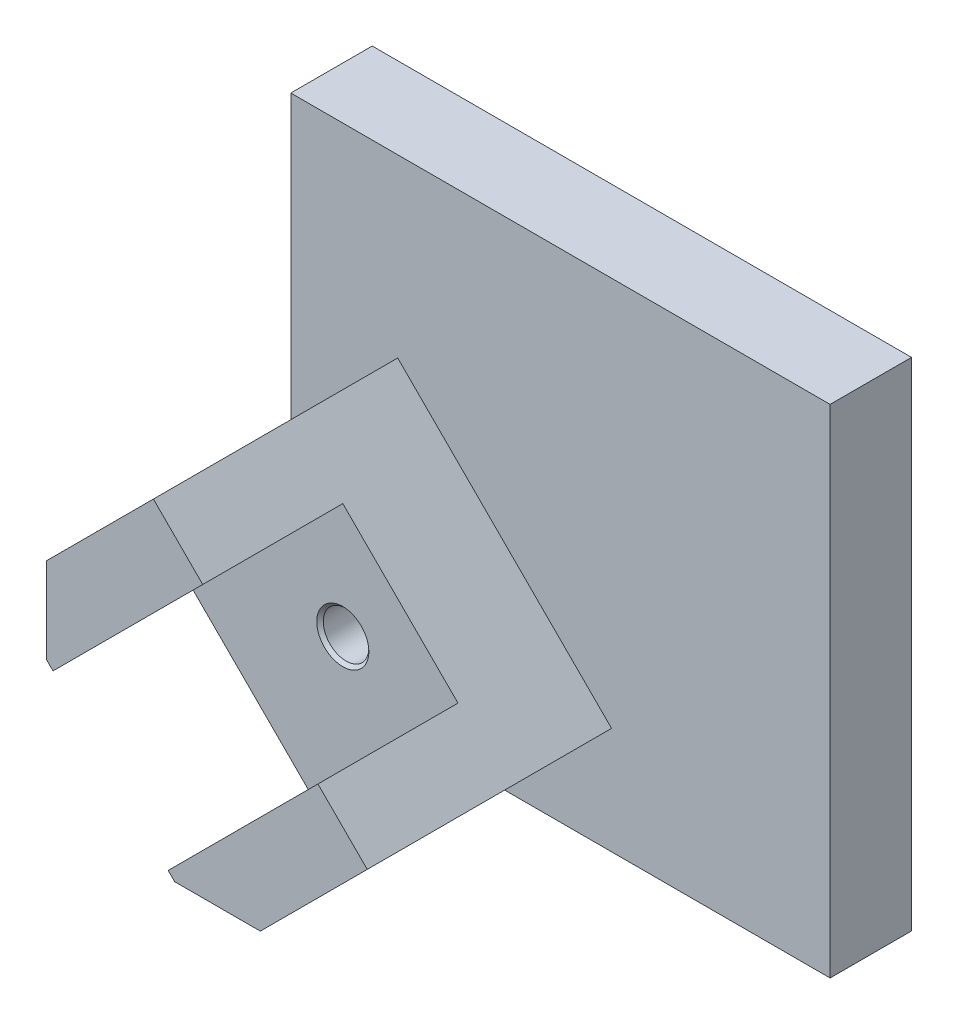
ISO-10303-21;
HEADER;
FILE_DESCRIPTION(('STEP AP214'),'2;1');
FILE_NAME('part.step','',(''),(''),'','','');
FILE_SCHEMA(('AUTOMOTIVE_DESIGN { 1 0 10303 214 1 1 1 1 }'));
ENDSEC;
DATA;
#1=APPLICATION_CONTEXT('core data for automotive mechanical design processes');
#2=APPLICATION_PROTOCOL_DEFINITION('international standard','automotive_design',2000,#1);
#3=PRODUCT_CONTEXT('',#1,'mechanical');
#4=PRODUCT('Part','Part','',(#3));
#5=PRODUCT_RELATED_PRODUCT_CATEGORY('part','',(#4));
#6=PRODUCT_DEFINITION_FORMATION('','',#4);
#7=PRODUCT_DEFINITION_CONTEXT('part definition',#1,'design');
#8=PRODUCT_DEFINITION('design','',#6,#7);
#9=PRODUCT_DEFINITION_SHAPE('','',#8);
#10=(LENGTH_UNIT() NAMED_UNIT(*) SI_UNIT(.MILLI.,.METRE.));
#11=(NAMED_UNIT(*) PLANE_ANGLE_UNIT() SI_UNIT($,.RADIAN.));
#12=(NAMED_UNIT(*) SI_UNIT($,.STERADIAN.) SOLID_ANGLE_UNIT());
#13=UNCERTAINTY_MEASURE_WITH_UNIT(LENGTH_MEASURE(1.E-05),#10,'distance_accuracy_value','');
#14=(GEOMETRIC_REPRESENTATION_CONTEXT(3) GLOBAL_UNCERTAINTY_ASSIGNED_CONTEXT((#13)) GLOBAL_UNIT_ASSIGNED_CONTEXT((#10,
#11,#12)) REPRESENTATION_CONTEXT('',''));
#15=CARTESIAN_POINT('',(0.,0.,0.));
#16=DIRECTION('',(0.,0.,1.));
#17=DIRECTION('',(1.,0.,0.));
#18=AXIS2_PLACEMENT_3D('',#15,#16,#17);
#19=CARTESIAN_POINT('',(-81.3335645941824,-26.8138207152516,-0.254000000000001));
#20=DIRECTION('',(0.,0.,-1.));
#21=DIRECTION('',(0.,1.,0.));
#22=AXIS2_PLACEMENT_3D('',#19,#20,#21);
#23=PLANE('',#22);
#24=DIRECTION('',(-0.707106781186548,-0.707106781186547,0.));
#25=VECTOR('',#24,1.);
#26=CARTESIAN_POINT('',(-81.3335645941824,-26.8138207152516,-0.254000000000001));
#27=LINE('',#26,#25);
#28=CARTESIAN_POINT('',(-81.3335645941824,-26.8138207152516,-0.254000000000001));
#29=VERTEX_POINT('',#28);
#30=CARTESIAN_POINT('',(-91.8404642558334,-37.3207203769025,-0.254000000000001));
#31=VERTEX_POINT('',#30);
#32=EDGE_CURVE('E374',#29,#31,#27,.T.);
#33=ORIENTED_EDGE('',*,*,#32,.T.);
#34=DIRECTION('',(-0.707106781186547,0.707106781186548,0.));
#35=VECTOR('',#34,1.);
#36=CARTESIAN_POINT('',(-100.820720376903,-28.3404642558334,-0.254));
#37=LINE('',#36,#35);
#38=CARTESIAN_POINT('',(-100.820720376903,-28.3404642558334,-0.254));
#39=VERTEX_POINT('',#38);
#40=EDGE_CURVE('E446',#31,#39,#37,.T.);
#41=ORIENTED_EDGE('',*,*,#40,.T.);
#42=DIRECTION('',(-0.707106781186548,-0.707106781186547,0.));
#43=VECTOR('',#42,1.);
#44=CARTESIAN_POINT('',(-90.3138207152516,-17.8335645941824,-0.254));
#45=LINE('',#44,#43);
#46=CARTESIAN_POINT('',(-90.3138207152516,-17.8335645941824,-0.254));
#47=VERTEX_POINT('',#46);
#48=EDGE_CURVE('E371',#47,#39,#45,.T.);
#49=ORIENTED_EDGE('',*,*,#48,.F.);
#50=DIRECTION('',(0.707106781186547,-0.707106781186548,0.));
#51=VECTOR('',#50,1.);
#52=CARTESIAN_POINT('',(-81.3335645941824,-26.8138207152516,-0.254000000000001));
#53=LINE('',#52,#51);
#54=EDGE_CURVE('E362',#47,#29,#53,.T.);
#55=ORIENTED_EDGE('',*,*,#54,.T.);
#56=EDGE_LOOP('',(#33,#41,#49,#55));
#57=FACE_BOUND('',#56,.T.);
#58=DIRECTION('',(1.,0.,0.));
#59=VECTOR('',#58,1.);
#60=CARTESIAN_POINT('',(-91.6154996287571,-29.7257951031447,-0.254000000000001));
#61=LINE('',#60,#59);
#62=CARTESIAN_POINT('',(-91.6154996287571,-29.7257951031447,-0.254000000000001));
#63=VERTEX_POINT('',#62);
#64=CARTESIAN_POINT('',(-87.2160905775322,-29.7257951031447,-0.254000000000001));
#65=VERTEX_POINT('',#64);
#66=EDGE_CURVE('E271',#63,#65,#61,.T.);
#67=ORIENTED_EDGE('',*,*,#66,.T.);
#68=DIRECTION('',(0.500000000000001,0.866025403784438,0.));
#69=VECTOR('',#68,1.);
#70=CARTESIAN_POINT('',(-87.2160905775322,-29.7257951031447,-0.254000000000001));
#71=LINE('',#70,#69);
#72=CARTESIAN_POINT('',(-85.0163860519197,-25.9157951031447,-0.254000000000001));
#73=VERTEX_POINT('',#72);
#74=EDGE_CURVE('E63',#65,#73,#71,.T.);
#75=ORIENTED_EDGE('',*,*,#74,.T.);
#76=DIRECTION('',(-0.5,0.866025403784438,0.));
#77=VECTOR('',#76,1.);
#78=CARTESIAN_POINT('',(-85.0163860519197,-25.9157951031447,-0.254000000000001));
#79=LINE('',#78,#77);
#80=CARTESIAN_POINT('',(-87.2160905775322,-22.1057951031447,-0.254000000000001));
#81=VERTEX_POINT('',#80);
#82=EDGE_CURVE('E259',#73,#81,#79,.T.);
#83=ORIENTED_EDGE('',*,*,#82,.T.);
#84=DIRECTION('',(-1.,0.,0.));
#85=VECTOR('',#84,1.);
#86=CARTESIAN_POINT('',(-87.2160905775322,-22.1057951031447,-0.254000000000001));
#87=LINE('',#86,#85);
#88=CARTESIAN_POINT('',(-91.6154996287571,-22.1057951031447,-0.254));
#89=VERTEX_POINT('',#88);
#90=EDGE_CURVE('E280',#81,#89,#87,.T.);
#91=ORIENTED_EDGE('',*,*,#90,.T.);
#92=DIRECTION('',(-0.500000000000001,-0.866025403784438,0.));
#93=VECTOR('',#92,1.);
#94=CARTESIAN_POINT('',(-91.6154996287571,-22.1057951031447,-0.254));
#95=LINE('',#94,#93);
#96=CARTESIAN_POINT('',(-93.8152041543696,-25.9157951031447,-0.254));
#97=VERTEX_POINT('',#96);
#98=EDGE_CURVE('E277',#89,#97,#95,.T.);
#99=ORIENTED_EDGE('',*,*,#98,.T.);
#100=DIRECTION('',(0.5,-0.866025403784438,0.));
#101=VECTOR('',#100,1.);
#102=CARTESIAN_POINT('',(-93.8152041543696,-25.9157951031447,-0.254));
#103=LINE('',#102,#101);
#104=EDGE_CURVE('E274',#97,#63,#103,.T.);
#105=ORIENTED_EDGE('',*,*,#104,.T.);
#106=EDGE_LOOP('',(#67,#75,#83,#91,#99,#105));
#107=FACE_BOUND('',#106,.T.);
#108=ADVANCED_FACE('F40',(#57,#107),#23,.T.);
#109=CARTESIAN_POINT('',(-89.4157951031446,-25.9157951031447,-5.28294342779873));
#110=DIRECTION('',(0.,0.,1.));
#111=DIRECTION('',(1.,0.,0.));
#112=AXIS2_PLACEMENT_3D('',#109,#110,#111);
#113=CYLINDRICAL_SURFACE('',#112,1.77800000000001);
#114=CARTESIAN_POINT('',(-89.4157951031446,-25.9157951031447,7.87399999999997));
#115=DIRECTION('',(0.,0.,1.));
#116=DIRECTION('',(1.,0.,0.));
#117=AXIS2_PLACEMENT_3D('',#114,#115,#116);
#118=CIRCLE('',#117,1.77800000000001);
#119=CARTESIAN_POINT('',(-87.6377951031446,-25.9157951031447,7.87399999999997));
#120=VERTEX_POINT('',#119);
#121=EDGE_CURVE('E455',#120,#120,#118,.T.);
#122=ORIENTED_EDGE('',*,*,#121,.T.);
#123=EDGE_LOOP('',(#122));
#124=FACE_BOUND('',#123,.T.);
#125=CARTESIAN_POINT('',(-89.4157951031446,-25.9157951031447,3.048));
#126=DIRECTION('',(0.,0.,-1.));
#127=DIRECTION('',(-1.,0.,0.));
#128=AXIS2_PLACEMENT_3D('',#125,#126,#127);
#129=CIRCLE('',#128,1.77800000000001);
#130=CARTESIAN_POINT('',(-91.1937951031446,-25.9157951031447,3.048));
#131=VERTEX_POINT('',#130);
#132=EDGE_CURVE('E287',#131,#131,#129,.T.);
#133=ORIENTED_EDGE('',*,*,#132,.T.);
#134=EDGE_LOOP('',(#133));
#135=FACE_BOUND('',#134,.T.);
#136=ADVANCED_FACE('F516',(#124,#135),#113,.F.);
#137=CARTESIAN_POINT('',(0.,0.,0.));
#138=DIRECTION('',(0.,0.,1.));
#139=DIRECTION('',(1.,0.,0.));
#140=AXIS2_PLACEMENT_3D('',#137,#138,#139);
#141=PLANE('',#140);
#142=DIRECTION('',(0.,-1.,0.));
#143=VECTOR('',#142,1.);
#144=CARTESIAN_POINT('',(-59.5491194918497,0.,0.));
#145=LINE('',#144,#143);
#146=CARTESIAN_POINT('',(-59.5491194918497,0.634999999999986,0.));
#147=VERTEX_POINT('',#146);
#148=CARTESIAN_POINT('',(-59.5491194918497,-38.1,0.));
#149=VERTEX_POINT('',#148);
#150=EDGE_CURVE('E253',#147,#149,#145,.T.);
#151=ORIENTED_EDGE('',*,*,#150,.F.);
#152=DIRECTION('',(1.,0.,0.));
#153=VECTOR('',#152,1.);
#154=CARTESIAN_POINT('',(0.,0.634999999999989,0.));
#155=LINE('',#154,#153);
#156=CARTESIAN_POINT('',(-101.6,0.634999999999983,0.));
#157=VERTEX_POINT('',#156);
#158=EDGE_CURVE('E235',#157,#147,#155,.T.);
#159=ORIENTED_EDGE('',*,*,#158,.F.);
#160=DIRECTION('',(0.,1.,0.));
#161=VECTOR('',#160,1.);
#162=CARTESIAN_POINT('',(-101.6,-28.1,0.));
#163=LINE('',#162,#161);
#164=CARTESIAN_POINT('',(-101.6,-21.4256670426101,0.));
#165=VERTEX_POINT('',#164);
#166=EDGE_CURVE('E418',#165,#157,#163,.T.);
#167=ORIENTED_EDGE('',*,*,#166,.F.);
#168=DIRECTION('',(-0.707106781186548,-0.707106781186547,0.));
#169=VECTOR('',#168,1.);
#170=CARTESIAN_POINT('',(-101.6,-21.4256670426101,0.));
#171=LINE('',#170,#169);
#172=CARTESIAN_POINT('',(-93.262833521305,-13.0885005639151,0.));
#173=VERTEX_POINT('',#172);
#174=EDGE_CURVE('E383',#173,#165,#171,.T.);
#175=ORIENTED_EDGE('',*,*,#174,.F.);
#176=DIRECTION('',(-0.707106781186548,0.707106781186547,0.));
#177=VECTOR('',#176,1.);
#178=CARTESIAN_POINT('',(-76.5885005639151,-29.762833521305,0.));
#179=LINE('',#178,#177);
#180=CARTESIAN_POINT('',(-76.5885005639151,-29.762833521305,0.));
#181=VERTEX_POINT('',#180);
#182=EDGE_CURVE('E400',#181,#173,#179,.T.);
#183=ORIENTED_EDGE('',*,*,#182,.F.);
#184=DIRECTION('',(0.707106781186547,0.707106781186547,0.));
#185=VECTOR('',#184,1.);
#186=CARTESIAN_POINT('',(-84.9256670426101,-38.1,0.));
#187=LINE('',#186,#185);
#188=CARTESIAN_POINT('',(-84.9256670426101,-38.1,0.));
#189=VERTEX_POINT('',#188);
#190=EDGE_CURVE('E370',#189,#181,#187,.T.);
#191=ORIENTED_EDGE('',*,*,#190,.F.);
#192=DIRECTION('',(-1.,0.,0.));
#193=VECTOR('',#192,1.);
#194=CARTESIAN_POINT('',(91.6,-38.1,0.));
#195=LINE('',#194,#193);
#196=EDGE_CURVE('E414',#149,#189,#195,.T.);
#197=ORIENTED_EDGE('',*,*,#196,.F.);
#198=EDGE_LOOP('',(#151,#159,#167,#175,#183,#191,#197));
#199=FACE_BOUND('',#198,.T.);
#200=ADVANCED_FACE('F463',(#199),#141,.T.);
#201=CARTESIAN_POINT('',(0.,0.,19.05));
#202=DIRECTION('',(0.,0.,-1.));
#203=DIRECTION('',(-1.,0.,0.));
#204=AXIS2_PLACEMENT_3D('',#201,#202,#203);
#205=PLANE('',#204);
#206=DIRECTION('',(-0.707106781186548,0.707106781186547,0.));
#207=VECTOR('',#206,1.);
#208=CARTESIAN_POINT('',(-76.5885005639151,-29.762833521305,19.05));
#209=LINE('',#208,#207);
#210=CARTESIAN_POINT('',(-76.5885005639151,-29.762833521305,19.05));
#211=VERTEX_POINT('',#210);
#212=CARTESIAN_POINT('',(-80.4355389820755,-25.9157951031447,19.05));
#213=VERTEX_POINT('',#212);
#214=EDGE_CURVE('E386',#211,#213,#209,.T.);
#215=ORIENTED_EDGE('',*,*,#214,.T.);
#216=DIRECTION('',(0.707106781186548,0.707106781186547,0.));
#217=VECTOR('',#216,1.);
#218=CARTESIAN_POINT('',(-92.1098719394654,-37.5901280605346,19.05));
#219=LINE('',#218,#217);
#220=CARTESIAN_POINT('',(-92.1098719394654,-37.5901280605346,19.05));
#221=VERTEX_POINT('',#220);
#222=EDGE_CURVE('E310',#221,#213,#219,.T.);
#223=ORIENTED_EDGE('',*,*,#222,.F.);
#224=DIRECTION('',(0.707106781186547,-0.707106781186548,0.));
#225=VECTOR('',#224,1.);
#226=CARTESIAN_POINT('',(-101.6,-28.1,19.05));
#227=LINE('',#226,#225);
#228=CARTESIAN_POINT('',(-91.6,-38.1,19.05));
#229=VERTEX_POINT('',#228);
#230=EDGE_CURVE('E394',#221,#229,#227,.T.);
#231=ORIENTED_EDGE('',*,*,#230,.T.);
#232=DIRECTION('',(1.,0.,0.));
#233=VECTOR('',#232,1.);
#234=CARTESIAN_POINT('',(-91.6,-38.1,19.05));
#235=LINE('',#234,#233);
#236=CARTESIAN_POINT('',(-84.9256670426101,-38.1,19.05));
#237=VERTEX_POINT('',#236);
#238=EDGE_CURVE('E379',#229,#237,#235,.T.);
#239=ORIENTED_EDGE('',*,*,#238,.T.);
#240=DIRECTION('',(0.707106781186547,0.707106781186547,0.));
#241=VECTOR('',#240,1.);
#242=CARTESIAN_POINT('',(-84.9256670426101,-38.1,19.05));
#243=LINE('',#242,#241);
#244=EDGE_CURVE('E382',#237,#211,#243,.T.);
#245=ORIENTED_EDGE('',*,*,#244,.T.);
#246=EDGE_LOOP('',(#215,#223,#231,#239,#245));
#247=FACE_BOUND('',#246,.T.);
#248=ADVANCED_FACE('F529',(#247),#205,.F.);
#249=CARTESIAN_POINT('',(0.,0.,-6.35));
#250=DIRECTION('',(0.,0.,1.));
#251=DIRECTION('',(1.,0.,0.));
#252=AXIS2_PLACEMENT_3D('',#249,#250,#251);
#253=PLANE('',#252);
#254=DIRECTION('',(1.,0.,0.));
#255=VECTOR('',#254,1.);
#256=CARTESIAN_POINT('',(-132.791043925641,0.634999999999983,-6.35));
#257=LINE('',#256,#255);
#258=CARTESIAN_POINT('',(-101.6,0.634999999999986,-6.35));
#259=VERTEX_POINT('',#258);
#260=CARTESIAN_POINT('',(-59.5491194918497,0.634999999999986,-6.35));
#261=VERTEX_POINT('',#260);
#262=EDGE_CURVE('E55',#259,#261,#257,.T.);
#263=ORIENTED_EDGE('',*,*,#262,.T.);
#264=DIRECTION('',(0.,-1.,0.));
#265=VECTOR('',#264,1.);
#266=CARTESIAN_POINT('',(-59.5491194918497,0.634999999999986,-6.35));
#267=LINE('',#266,#265);
#268=CARTESIAN_POINT('',(-59.5491194918497,-38.1,-6.35));
#269=VERTEX_POINT('',#268);
#270=EDGE_CURVE('E238',#261,#269,#267,.T.);
#271=ORIENTED_EDGE('',*,*,#270,.T.);
#272=DIRECTION('',(-1.,0.,0.));
#273=VECTOR('',#272,1.);
#274=CARTESIAN_POINT('',(91.6,-38.1,-6.35));
#275=LINE('',#274,#273);
#276=CARTESIAN_POINT('',(-91.6,-38.1,-6.35));
#277=VERTEX_POINT('',#276);
#278=EDGE_CURVE('E415',#269,#277,#275,.T.);
#279=ORIENTED_EDGE('',*,*,#278,.T.);
#280=DIRECTION('',(-0.707106781186547,0.707106781186548,0.));
#281=VECTOR('',#280,1.);
#282=CARTESIAN_POINT('',(-91.6,-38.1,-6.35));
#283=LINE('',#282,#281);
#284=CARTESIAN_POINT('',(-94.2874683207997,-35.4125316792003,-6.35));
#285=VERTEX_POINT('',#284);
#286=EDGE_CURVE('E419',#277,#285,#283,.T.);
#287=ORIENTED_EDGE('',*,*,#286,.T.);
#288=DIRECTION('',(-0.0716124339385754,0.997432533711124,0.));
#289=VECTOR('',#288,1.);
#290=CARTESIAN_POINT('',(-94.2360322517823,-36.1289437018401,-6.35));
#291=LINE('',#290,#289);
#292=CARTESIAN_POINT('',(-94.329145834501,-34.8320387982348,-6.35));
#293=VERTEX_POINT('',#292);
#294=EDGE_CURVE('E433',#285,#293,#291,.T.);
#295=ORIENTED_EDGE('',*,*,#294,.T.);
#296=DIRECTION('',(-0.707106781186548,-0.707106781186547,0.));
#297=VECTOR('',#296,1.);
#298=CARTESIAN_POINT('',(-83.8222461728501,-24.3251391365839,-6.35));
#299=LINE('',#298,#297);
#300=CARTESIAN_POINT('',(-83.8222461728501,-24.3251391365839,-6.35));
#301=VERTEX_POINT('',#300);
#302=EDGE_CURVE('E366',#301,#293,#299,.T.);
#303=ORIENTED_EDGE('',*,*,#302,.F.);
#304=DIRECTION('',(-0.707106781186546,0.707106781186549,0.));
#305=VECTOR('',#304,1.);
#306=CARTESIAN_POINT('',(-87.8251391365839,-20.3222461728501,-6.35));
#307=LINE('',#306,#305);
#308=CARTESIAN_POINT('',(-87.8251391365839,-20.3222461728502,-6.35));
#309=VERTEX_POINT('',#308);
#310=EDGE_CURVE('E355',#301,#309,#307,.T.);
#311=ORIENTED_EDGE('',*,*,#310,.T.);
#312=DIRECTION('',(-0.707106781186548,-0.707106781186547,0.));
#313=VECTOR('',#312,1.);
#314=CARTESIAN_POINT('',(-87.8251391365839,-20.3222461728501,-6.35));
#315=LINE('',#314,#313);
#316=CARTESIAN_POINT('',(-98.3320387982348,-30.8291458345011,-6.35));
#317=VERTEX_POINT('',#316);
#318=EDGE_CURVE('E367',#309,#317,#315,.T.);
#319=ORIENTED_EDGE('',*,*,#318,.T.);
#320=DIRECTION('',(-0.997432533711124,0.0716124339385734,0.));
#321=VECTOR('',#320,1.);
#322=CARTESIAN_POINT('',(-96.9631931250052,-30.9274245320903,-6.35));
#323=LINE('',#322,#321);
#324=CARTESIAN_POINT('',(-98.9125316792003,-30.7874683207997,-6.35));
#325=VERTEX_POINT('',#324);
#326=EDGE_CURVE('E431',#317,#325,#323,.T.);
#327=ORIENTED_EDGE('',*,*,#326,.T.);
#328=CARTESIAN_POINT('',(-101.6,-28.1,-6.35));
#329=VERTEX_POINT('',#328);
#330=EDGE_CURVE('E417',#325,#329,#283,.T.);
#331=ORIENTED_EDGE('',*,*,#330,.T.);
#332=DIRECTION('',(0.,1.,0.));
#333=VECTOR('',#332,1.);
#334=CARTESIAN_POINT('',(-101.6,-28.1,-6.35));
#335=LINE('',#334,#333);
#336=EDGE_CURVE('E249',#329,#259,#335,.T.);
#337=ORIENTED_EDGE('',*,*,#336,.T.);
#338=EDGE_LOOP('',(#263,#271,#279,#287,#295,#303,#311,#319,#327,#331,#337));
#339=FACE_BOUND('',#338,.T.);
#340=DIRECTION('',(-0.707106781186547,0.707106781186548,0.));
#341=VECTOR('',#340,1.);
#342=CARTESIAN_POINT('',(-46.8894877578617,-46.8894877578617,-6.35));
#343=LINE('',#342,#341);
#344=CARTESIAN_POINT('',(-73.7901494524844,-19.988826063239,-6.35));
#345=VERTEX_POINT('',#344);
#346=CARTESIAN_POINT('',(-83.488826063239,-10.2901494524843,-6.35));
#347=VERTEX_POINT('',#346);
#348=EDGE_CURVE('E338',#345,#347,#343,.T.);
#349=ORIENTED_EDGE('',*,*,#348,.F.);
#350=DIRECTION('',(-0.707106781186566,-0.707106781186529,0.));
#351=VECTOR('',#350,1.);
#352=CARTESIAN_POINT('',(-26.9006616946208,26.9006616946222,-6.35));
#353=LINE('',#352,#351);
#354=CARTESIAN_POINT('',(-71.0960726161636,-17.2947492269184,-6.35));
#355=VERTEX_POINT('',#354);
#356=EDGE_CURVE('E315',#355,#345,#353,.T.);
#357=ORIENTED_EDGE('',*,*,#356,.F.);
#358=DIRECTION('',(0.707106781186544,-0.707106781186551,0.));
#359=VECTOR('',#358,1.);
#360=CARTESIAN_POINT('',(-44.1954109215413,-44.1954109215409,-6.35));
#361=LINE('',#360,#359);
#362=CARTESIAN_POINT('',(-80.7947492269183,-7.59607261616357,-6.35));
#363=VERTEX_POINT('',#362);
#364=EDGE_CURVE('E327',#363,#355,#361,.T.);
#365=ORIENTED_EDGE('',*,*,#364,.F.);
#366=DIRECTION('',(0.707106781186548,0.707106781186547,0.));
#367=VECTOR('',#366,1.);
#368=CARTESIAN_POINT('',(-36.5993383053773,36.5993383053774,-6.35));
#369=LINE('',#368,#367);
#370=EDGE_CURVE('E341',#347,#363,#369,.T.);
#371=ORIENTED_EDGE('',*,*,#370,.F.);
#372=EDGE_LOOP('',(#349,#357,#365,#371));
#373=FACE_BOUND('',#372,.T.);
#374=ADVANCED_FACE('F246',(#339,#373),#253,.F.);
#375=CARTESIAN_POINT('',(-91.6,-38.1,-6.35));
#376=DIRECTION('',(0.707106781186548,0.707106781186547,0.));
#377=DIRECTION('',(-0.707106781186547,0.707106781186548,0.));
#378=AXIS2_PLACEMENT_3D('',#375,#376,#377);
#379=PLANE('',#378);
#380=ORIENTED_EDGE('',*,*,#230,.F.);
#381=DIRECTION('',(0.,0.,1.));
#382=VECTOR('',#381,1.);
#383=CARTESIAN_POINT('',(-92.1098719394654,-37.5901280605346,8.128));
#384=LINE('',#383,#382);
#385=CARTESIAN_POINT('',(-92.1098719394654,-37.5901280605346,8.128));
#386=VERTEX_POINT('',#385);
#387=EDGE_CURVE('E313',#386,#221,#384,.T.);
#388=ORIENTED_EDGE('',*,*,#387,.F.);
#389=DIRECTION('',(0.707106781186548,-0.707106781186547,0.));
#390=VECTOR('',#389,1.);
#391=CARTESIAN_POINT('',(-101.090128060535,-28.6098719394654,8.128));
#392=LINE('',#391,#390);
#393=CARTESIAN_POINT('',(-101.090128060535,-28.6098719394654,8.128));
#394=VERTEX_POINT('',#393);
#395=EDGE_CURVE('E307',#394,#386,#392,.T.);
#396=ORIENTED_EDGE('',*,*,#395,.F.);
#397=DIRECTION('',(0.,0.,1.));
#398=VECTOR('',#397,1.);
#399=CARTESIAN_POINT('',(-101.090128060535,-28.6098719394654,8.128));
#400=LINE('',#399,#398);
#401=CARTESIAN_POINT('',(-101.090128060535,-28.6098719394654,19.05));
#402=VERTEX_POINT('',#401);
#403=EDGE_CURVE('E316',#394,#402,#400,.T.);
#404=ORIENTED_EDGE('',*,*,#403,.T.);
#405=CARTESIAN_POINT('',(-101.6,-28.1,19.05));
#406=VERTEX_POINT('',#405);
#407=EDGE_CURVE('E395',#406,#402,#227,.T.);
#408=ORIENTED_EDGE('',*,*,#407,.F.);
#409=DIRECTION('',(0.,0.,1.));
#410=VECTOR('',#409,1.);
#411=CARTESIAN_POINT('',(-101.6,-28.1,-6.35));
#412=LINE('',#411,#410);
#413=EDGE_CURVE('E423',#329,#406,#412,.T.);
#414=ORIENTED_EDGE('',*,*,#413,.F.);
#415=ORIENTED_EDGE('',*,*,#330,.F.);
#416=DIRECTION('',(-0.353553390593272,0.353553390593272,0.86602540378444));
#417=VECTOR('',#416,1.);
#418=CARTESIAN_POINT('',(-101.323441958535,-28.3765580414653,-0.444499999999991));
#419=LINE('',#418,#417);
#420=CARTESIAN_POINT('',(-101.556755856535,-28.1432441434652,0.126999999999993));
#421=VERTEX_POINT('',#420);
#422=EDGE_CURVE('E437',#325,#421,#419,.T.);
#423=ORIENTED_EDGE('',*,*,#422,.T.);
#424=DIRECTION('',(0.707106781186547,-0.707106781186548,0.));
#425=VECTOR('',#424,1.);
#426=CARTESIAN_POINT('',(-92.1098719394654,-37.5901280605346,0.126999999999991));
#427=LINE('',#426,#425);
#428=CARTESIAN_POINT('',(-91.6432441434653,-38.0567558565348,0.126999999999991));
#429=VERTEX_POINT('',#428);
#430=EDGE_CURVE('E435',#421,#429,#427,.T.);
#431=ORIENTED_EDGE('',*,*,#430,.T.);
#432=DIRECTION('',(-0.353553390593272,0.353553390593272,-0.86602540378444));
#433=VECTOR('',#432,1.);
#434=CARTESIAN_POINT('',(-94.365239620133,-35.334760379867,-6.54049999999999));
#435=LINE('',#434,#433);
#436=EDGE_CURVE('E439',#429,#285,#435,.T.);
#437=ORIENTED_EDGE('',*,*,#436,.T.);
#438=ORIENTED_EDGE('',*,*,#286,.F.);
#439=DIRECTION('',(0.,0.,1.));
#440=VECTOR('',#439,1.);
#441=CARTESIAN_POINT('',(-91.6,-38.1,-6.35));
#442=LINE('',#441,#440);
#443=EDGE_CURVE('E428',#277,#229,#442,.T.);
#444=ORIENTED_EDGE('',*,*,#443,.T.);
#445=EDGE_LOOP('',(#380,#388,#396,#404,#408,#414,#415,#423,#431,#437,#438,#444));
#446=FACE_BOUND('',#445,.T.);
#447=ADVANCED_FACE('F476',(#446),#379,.F.);
#448=CARTESIAN_POINT('',(91.6,-38.1,-6.35));
#449=DIRECTION('',(0.,1.,0.));
#450=DIRECTION('',(0.,0.,1.));
#451=AXIS2_PLACEMENT_3D('',#448,#449,#450);
#452=PLANE('',#451);
#453=ORIENTED_EDGE('',*,*,#278,.F.);
#454=DIRECTION('',(0.,0.,1.));
#455=VECTOR('',#454,1.);
#456=CARTESIAN_POINT('',(-59.5491194918497,-38.1,-6.35));
#457=LINE('',#456,#455);
#458=EDGE_CURVE('E11',#269,#149,#457,.T.);
#459=ORIENTED_EDGE('',*,*,#458,.T.);
#460=ORIENTED_EDGE('',*,*,#196,.T.);
#461=DIRECTION('',(0.,0.,-1.));
#462=VECTOR('',#461,1.);
#463=CARTESIAN_POINT('',(-84.9256670426101,-38.1,19.05));
#464=LINE('',#463,#462);
#465=EDGE_CURVE('E411',#237,#189,#464,.T.);
#466=ORIENTED_EDGE('',*,*,#465,.F.);
#467=ORIENTED_EDGE('',*,*,#238,.F.);
#468=ORIENTED_EDGE('',*,*,#443,.F.);
#469=EDGE_LOOP('',(#453,#459,#460,#466,#467,#468));
#470=FACE_BOUND('',#469,.T.);
#471=ADVANCED_FACE('F468',(#470),#452,.F.);
#472=CARTESIAN_POINT('',(-101.6,-28.1,-6.35));
#473=DIRECTION('',(1.,0.,0.));
#474=DIRECTION('',(0.,0.,-1.));
#475=AXIS2_PLACEMENT_3D('',#472,#473,#474);
#476=PLANE('',#475);
#477=ORIENTED_EDGE('',*,*,#166,.T.);
#478=DIRECTION('',(0.,0.,-1.));
#479=VECTOR('',#478,1.);
#480=CARTESIAN_POINT('',(-101.6,0.634999999999983,-6.35));
#481=LINE('',#480,#479);
#482=EDGE_CURVE('E48',#157,#259,#481,.T.);
#483=ORIENTED_EDGE('',*,*,#482,.T.);
#484=ORIENTED_EDGE('',*,*,#336,.F.);
#485=ORIENTED_EDGE('',*,*,#413,.T.);
#486=DIRECTION('',(0.,-1.,0.));
#487=VECTOR('',#486,1.);
#488=CARTESIAN_POINT('',(-101.6,-21.4256670426101,19.05));
#489=LINE('',#488,#487);
#490=CARTESIAN_POINT('',(-101.6,-21.4256670426101,19.05));
#491=VERTEX_POINT('',#490);
#492=EDGE_CURVE('E391',#491,#406,#489,.T.);
#493=ORIENTED_EDGE('',*,*,#492,.F.);
#494=DIRECTION('',(0.,0.,-1.));
#495=VECTOR('',#494,1.);
#496=CARTESIAN_POINT('',(-101.6,-21.4256670426101,19.05));
#497=LINE('',#496,#495);
#498=EDGE_CURVE('E398',#491,#165,#497,.T.);
#499=ORIENTED_EDGE('',*,*,#498,.T.);
#500=EDGE_LOOP('',(#477,#483,#484,#485,#493,#499));
#501=FACE_BOUND('',#500,.T.);
#502=ADVANCED_FACE('F460',(#501),#476,.F.);
#503=CARTESIAN_POINT('',(-84.9256670426101,-38.1,19.05));
#504=DIRECTION('',(-0.707106781186547,0.707106781186547,0.));
#505=DIRECTION('',(-0.707106781186548,-0.707106781186548,0.));
#506=AXIS2_PLACEMENT_3D('',#503,#504,#505);
#507=PLANE('',#506);
#508=ORIENTED_EDGE('',*,*,#190,.T.);
#509=DIRECTION('',(0.,0.,-1.));
#510=VECTOR('',#509,1.);
#511=CARTESIAN_POINT('',(-76.5885005639151,-29.762833521305,19.05));
#512=LINE('',#511,#510);
#513=EDGE_CURVE('E408',#211,#181,#512,.T.);
#514=ORIENTED_EDGE('',*,*,#513,.F.);
#515=ORIENTED_EDGE('',*,*,#244,.F.);
#516=ORIENTED_EDGE('',*,*,#465,.T.);
#517=EDGE_LOOP('',(#508,#514,#515,#516));
#518=FACE_BOUND('',#517,.T.);
#519=ADVANCED_FACE('F536',(#518),#507,.F.);
#520=CARTESIAN_POINT('',(-76.5885005639151,-29.762833521305,19.05));
#521=DIRECTION('',(-0.707106781186547,-0.707106781186548,0.));
#522=DIRECTION('',(0.707106781186548,-0.707106781186547,0.));
#523=AXIS2_PLACEMENT_3D('',#520,#521,#522);
#524=PLANE('',#523);
#525=DIRECTION('',(-0.707106781186548,0.707106781186547,0.));
#526=VECTOR('',#525,1.);
#527=CARTESIAN_POINT('',(-80.4355389820755,-25.9157951031447,8.128));
#528=LINE('',#527,#526);
#529=CARTESIAN_POINT('',(-80.4355389820755,-25.9157951031447,8.128));
#530=VERTEX_POINT('',#529);
#531=CARTESIAN_POINT('',(-89.4157951031446,-16.9355389820755,8.128));
#532=VERTEX_POINT('',#531);
#533=EDGE_CURVE('E300',#530,#532,#528,.T.);
#534=ORIENTED_EDGE('',*,*,#533,.F.);
#535=DIRECTION('',(0.,0.,1.));
#536=VECTOR('',#535,1.);
#537=CARTESIAN_POINT('',(-80.4355389820755,-25.9157951031447,8.128));
#538=LINE('',#537,#536);
#539=EDGE_CURVE('E309',#530,#213,#538,.T.);
#540=ORIENTED_EDGE('',*,*,#539,.T.);
#541=ORIENTED_EDGE('',*,*,#214,.F.);
#542=ORIENTED_EDGE('',*,*,#513,.T.);
#543=ORIENTED_EDGE('',*,*,#182,.T.);
#544=DIRECTION('',(0.,0.,-1.));
#545=VECTOR('',#544,1.);
#546=CARTESIAN_POINT('',(-93.262833521305,-13.0885005639151,19.05));
#547=LINE('',#546,#545);
#548=CARTESIAN_POINT('',(-93.262833521305,-13.0885005639151,19.05));
#549=VERTEX_POINT('',#548);
#550=EDGE_CURVE('E405',#549,#173,#547,.T.);
#551=ORIENTED_EDGE('',*,*,#550,.F.);
#552=CARTESIAN_POINT('',(-89.4157951031446,-16.9355389820755,19.05));
#553=VERTEX_POINT('',#552);
#554=EDGE_CURVE('E385',#553,#549,#209,.T.);
#555=ORIENTED_EDGE('',*,*,#554,.F.);
#556=DIRECTION('',(0.,0.,1.));
#557=VECTOR('',#556,1.);
#558=CARTESIAN_POINT('',(-89.4157951031446,-16.9355389820755,8.128));
#559=LINE('',#558,#557);
#560=EDGE_CURVE('E319',#532,#553,#559,.T.);
#561=ORIENTED_EDGE('',*,*,#560,.F.);
#562=EDGE_LOOP('',(#534,#540,#541,#542,#543,#551,#555,#561));
#563=FACE_BOUND('',#562,.T.);
#564=ADVANCED_FACE('F532',(#563),#524,.F.);
#565=CARTESIAN_POINT('',(-101.6,-21.4256670426101,19.05));
#566=DIRECTION('',(0.707106781186547,-0.707106781186548,0.));
#567=DIRECTION('',(0.707106781186548,0.707106781186547,0.));
#568=AXIS2_PLACEMENT_3D('',#565,#566,#567);
#569=PLANE('',#568);
#570=ORIENTED_EDGE('',*,*,#174,.T.);
#571=ORIENTED_EDGE('',*,*,#498,.F.);
#572=DIRECTION('',(-0.707106781186548,-0.707106781186547,0.));
#573=VECTOR('',#572,1.);
#574=CARTESIAN_POINT('',(-101.6,-21.4256670426101,19.05));
#575=LINE('',#574,#573);
#576=EDGE_CURVE('E389',#549,#491,#575,.T.);
#577=ORIENTED_EDGE('',*,*,#576,.F.);
#578=ORIENTED_EDGE('',*,*,#550,.T.);
#579=EDGE_LOOP('',(#570,#571,#577,#578));
#580=FACE_BOUND('',#579,.T.);
#581=ADVANCED_FACE('F527',(#580),#569,.F.);
#582=ORIENTED_EDGE('',*,*,#407,.T.);
#583=DIRECTION('',(-0.707106781186548,-0.707106781186547,0.));
#584=VECTOR('',#583,1.);
#585=CARTESIAN_POINT('',(-89.4157951031446,-16.9355389820755,19.05));
#586=LINE('',#585,#584);
#587=EDGE_CURVE('E301',#553,#402,#586,.T.);
#588=ORIENTED_EDGE('',*,*,#587,.F.);
#589=ORIENTED_EDGE('',*,*,#554,.T.);
#590=ORIENTED_EDGE('',*,*,#576,.T.);
#591=ORIENTED_EDGE('',*,*,#492,.T.);
#592=EDGE_LOOP('',(#582,#588,#589,#590,#591));
#593=FACE_BOUND('',#592,.T.);
#594=ADVANCED_FACE('F524',(#593),#205,.F.);
#595=CARTESIAN_POINT('',(-90.3138207152516,-17.8335645941824,-0.254));
#596=DIRECTION('',(0.612372435695795,-0.612372435695796,0.499999999999998));
#597=DIRECTION('',(0.707106781186548,0.707106781186547,0.));
#598=AXIS2_PLACEMENT_3D('',#595,#596,#597);
#599=PLANE('',#598);
#600=ORIENTED_EDGE('',*,*,#48,.T.);
#601=DIRECTION('',(0.353553390593272,-0.353553390593272,-0.86602540378444));
#602=VECTOR('',#601,1.);
#603=CARTESIAN_POINT('',(-98.3320387982348,-30.8291458345011,-6.35));
#604=LINE('',#603,#602);
#605=EDGE_CURVE('E444',#39,#317,#604,.T.);
#606=ORIENTED_EDGE('',*,*,#605,.T.);
#607=ORIENTED_EDGE('',*,*,#318,.F.);
#608=DIRECTION('',(-0.353553390593272,0.353553390593273,0.86602540378444));
#609=VECTOR('',#608,1.);
#610=CARTESIAN_POINT('',(-90.3138207152516,-17.8335645941824,-0.254));
#611=LINE('',#610,#609);
#612=EDGE_CURVE('E364',#309,#47,#611,.T.);
#613=ORIENTED_EDGE('',*,*,#612,.T.);
#614=EDGE_LOOP('',(#600,#606,#607,#613));
#615=FACE_BOUND('',#614,.T.);
#616=ADVANCED_FACE('F501',(#615),#599,.T.);
#617=CARTESIAN_POINT('',(-83.8222461728501,-24.3251391365839,-6.35));
#618=DIRECTION('',(-0.612372435695795,0.612372435695796,0.499999999999998));
#619=DIRECTION('',(-0.707106781186548,-0.707106781186547,0.));
#620=AXIS2_PLACEMENT_3D('',#617,#618,#619);
#621=PLANE('',#620);
#622=ORIENTED_EDGE('',*,*,#302,.T.);
#623=DIRECTION('',(0.353553390593272,-0.353553390593272,0.86602540378444));
#624=VECTOR('',#623,1.);
#625=CARTESIAN_POINT('',(-91.8404642558334,-37.3207203769025,-0.254000000000001));
#626=LINE('',#625,#624);
#627=EDGE_CURVE('E442',#293,#31,#626,.T.);
#628=ORIENTED_EDGE('',*,*,#627,.T.);
#629=ORIENTED_EDGE('',*,*,#32,.F.);
#630=DIRECTION('',(-0.353553390593272,0.353553390593273,-0.86602540378444));
#631=VECTOR('',#630,1.);
#632=CARTESIAN_POINT('',(-83.8222461728501,-24.3251391365839,-6.35));
#633=LINE('',#632,#631);
#634=EDGE_CURVE('E358',#29,#301,#633,.T.);
#635=ORIENTED_EDGE('',*,*,#634,.T.);
#636=EDGE_LOOP('',(#622,#628,#629,#635));
#637=FACE_BOUND('',#636,.T.);
#638=ADVANCED_FACE('F485',(#637),#621,.T.);
#639=CARTESIAN_POINT('',(-54.0736926547172,-54.073692654717,0.));
#640=DIRECTION('',(0.707106781186549,0.707106781186546,0.));
#641=DIRECTION('',(0.707106781186546,-0.707106781186549,0.));
#642=AXIS2_PLACEMENT_3D('',#639,#640,#641);
#643=PLANE('',#642);
#644=ORIENTED_EDGE('',*,*,#310,.F.);
#645=ORIENTED_EDGE('',*,*,#634,.F.);
#646=ORIENTED_EDGE('',*,*,#54,.F.);
#647=ORIENTED_EDGE('',*,*,#612,.F.);
#648=EDGE_LOOP('',(#644,#645,#646,#647));
#649=FACE_BOUND('',#648,.T.);
#650=ADVANCED_FACE('F505',(#649),#643,.F.);
#651=CARTESIAN_POINT('',(-97.0843987594003,-32.6156012405997,-10.8279928354946));
#652=DIRECTION('',(-0.0669872981077811,-0.93301270189222,0.353553390593271));
#653=DIRECTION('',(0.353553390593272,-0.353553390593272,-0.86602540378444));
#654=AXIS2_PLACEMENT_3D('',#651,#652,#653);
#655=PLANE('',#654);
#656=ORIENTED_EDGE('',*,*,#326,.F.);
#657=ORIENTED_EDGE('',*,*,#605,.F.);
#658=DIRECTION('',(0.863950323522003,-0.231494791488328,-0.447213595499961));
#659=VECTOR('',#658,1.);
#660=CARTESIAN_POINT('',(-93.0913874512421,-30.4115327712954,-4.25499713419785));
#661=LINE('',#660,#659);
#662=EDGE_CURVE('E359',#421,#39,#661,.T.);
#663=ORIENTED_EDGE('',*,*,#662,.F.);
#664=ORIENTED_EDGE('',*,*,#422,.F.);
#665=EDGE_LOOP('',(#656,#657,#663,#664));
#666=FACE_BOUND('',#665,.T.);
#667=ADVANCED_FACE('F499',(#666),#655,.T.);
#668=CARTESIAN_POINT('',(-91.6,-38.1,0.126999999999991));
#669=DIRECTION('',(-0.500000000000002,-0.500000000000002,-0.707106781186544));
#670=DIRECTION('',(-0.707106781186547,0.707106781186548,0.));
#671=AXIS2_PLACEMENT_3D('',#668,#669,#670);
#672=PLANE('',#671);
#673=ORIENTED_EDGE('',*,*,#662,.T.);
#674=ORIENTED_EDGE('',*,*,#40,.F.);
#675=DIRECTION('',(0.231494791488329,-0.863950323522003,0.44721359549996));
#676=VECTOR('',#675,1.);
#677=CARTESIAN_POINT('',(-92.6435835788643,-34.3234382588109,-1.80550739141466));
#678=LINE('',#677,#676);
#679=EDGE_CURVE('E348',#429,#31,#678,.F.);
#680=ORIENTED_EDGE('',*,*,#679,.F.);
#681=ORIENTED_EDGE('',*,*,#430,.F.);
#682=EDGE_LOOP('',(#673,#674,#680,#681));
#683=FACE_BOUND('',#682,.T.);
#684=ADVANCED_FACE('F493',(#683),#672,.T.);
#685=CARTESIAN_POINT('',(-93.6156012405998,-36.0843987594003,-4.70426847853663));
#686=DIRECTION('',(-0.93301270189222,-0.0669872981077829,0.353553390593271));
#687=DIRECTION('',(0.353553390593272,-0.353553390593272,0.86602540378444));
#688=AXIS2_PLACEMENT_3D('',#685,#686,#687);
#689=PLANE('',#688);
#690=ORIENTED_EDGE('',*,*,#679,.T.);
#691=ORIENTED_EDGE('',*,*,#627,.F.);
#692=ORIENTED_EDGE('',*,*,#294,.F.);
#693=ORIENTED_EDGE('',*,*,#436,.F.);
#694=EDGE_LOOP('',(#690,#691,#692,#693));
#695=FACE_BOUND('',#694,.T.);
#696=ADVANCED_FACE('F481',(#695),#689,.T.);
#697=CARTESIAN_POINT('',(-26.9006616946208,26.9006616946222,-3.81));
#698=DIRECTION('',(0.707106781186529,-0.707106781186566,0.));
#699=DIRECTION('',(0.707106781186566,0.707106781186529,0.));
#700=AXIS2_PLACEMENT_3D('',#697,#698,#699);
#701=PLANE('',#700);
#702=ORIENTED_EDGE('',*,*,#356,.T.);
#703=DIRECTION('',(0.,0.,-1.));
#704=VECTOR('',#703,1.);
#705=CARTESIAN_POINT('',(-73.7901494524844,-19.988826063239,-3.81));
#706=LINE('',#705,#704);
#707=CARTESIAN_POINT('',(-73.7901494524844,-19.988826063239,-3.81));
#708=VERTEX_POINT('',#707);
#709=EDGE_CURVE('E336',#708,#345,#706,.T.);
#710=ORIENTED_EDGE('',*,*,#709,.F.);
#711=DIRECTION('',(-0.707106781186566,-0.707106781186529,0.));
#712=VECTOR('',#711,1.);
#713=CARTESIAN_POINT('',(-26.9006616946208,26.9006616946222,-3.81));
#714=LINE('',#713,#712);
#715=CARTESIAN_POINT('',(-71.0960726161636,-17.2947492269184,-3.81));
#716=VERTEX_POINT('',#715);
#717=EDGE_CURVE('E323',#716,#708,#714,.T.);
#718=ORIENTED_EDGE('',*,*,#717,.F.);
#719=DIRECTION('',(0.,0.,-1.));
#720=VECTOR('',#719,1.);
#721=CARTESIAN_POINT('',(-71.0960726161636,-17.2947492269184,-3.81));
#722=LINE('',#721,#720);
#723=EDGE_CURVE('E346',#716,#355,#722,.T.);
#724=ORIENTED_EDGE('',*,*,#723,.T.);
#725=EDGE_LOOP('',(#702,#710,#718,#724));
#726=FACE_BOUND('',#725,.T.);
#727=ADVANCED_FACE('F553',(#726),#701,.F.);
#728=CARTESIAN_POINT('',(-44.1954109215413,-44.1954109215409,-3.81));
#729=DIRECTION('',(0.707106781186551,0.707106781186544,0.));
#730=DIRECTION('',(-0.707106781186544,0.707106781186551,0.));
#731=AXIS2_PLACEMENT_3D('',#728,#729,#730);
#732=PLANE('',#731);
#733=ORIENTED_EDGE('',*,*,#364,.T.);
#734=ORIENTED_EDGE('',*,*,#723,.F.);
#735=DIRECTION('',(0.707106781186544,-0.707106781186551,0.));
#736=VECTOR('',#735,1.);
#737=CARTESIAN_POINT('',(-44.1954109215413,-44.1954109215409,-3.81));
#738=LINE('',#737,#736);
#739=CARTESIAN_POINT('',(-80.7947492269183,-7.59607261616357,-3.81));
#740=VERTEX_POINT('',#739);
#741=EDGE_CURVE('E333',#740,#716,#738,.T.);
#742=ORIENTED_EDGE('',*,*,#741,.F.);
#743=DIRECTION('',(0.,0.,-1.));
#744=VECTOR('',#743,1.);
#745=CARTESIAN_POINT('',(-80.7947492269183,-7.59607261616357,-3.81));
#746=LINE('',#745,#744);
#747=EDGE_CURVE('E349',#740,#363,#746,.T.);
#748=ORIENTED_EDGE('',*,*,#747,.T.);
#749=EDGE_LOOP('',(#733,#734,#742,#748));
#750=FACE_BOUND('',#749,.T.);
#751=ADVANCED_FACE('F569',(#750),#732,.F.);
#752=CARTESIAN_POINT('',(-36.5993383053773,36.5993383053774,-3.81));
#753=DIRECTION('',(-0.707106781186547,0.707106781186548,0.));
#754=DIRECTION('',(-0.707106781186548,-0.707106781186547,0.));
#755=AXIS2_PLACEMENT_3D('',#752,#753,#754);
#756=PLANE('',#755);
#757=ORIENTED_EDGE('',*,*,#370,.T.);
#758=ORIENTED_EDGE('',*,*,#747,.F.);
#759=DIRECTION('',(0.707106781186548,0.707106781186547,0.));
#760=VECTOR('',#759,1.);
#761=CARTESIAN_POINT('',(-36.5993383053773,36.5993383053774,-3.81));
#762=LINE('',#761,#760);
#763=CARTESIAN_POINT('',(-83.488826063239,-10.2901494524843,-3.81));
#764=VERTEX_POINT('',#763);
#765=EDGE_CURVE('E330',#764,#740,#762,.T.);
#766=ORIENTED_EDGE('',*,*,#765,.F.);
#767=DIRECTION('',(0.,0.,-1.));
#768=VECTOR('',#767,1.);
#769=CARTESIAN_POINT('',(-83.488826063239,-10.2901494524843,-3.81));
#770=LINE('',#769,#768);
#771=EDGE_CURVE('E351',#764,#347,#770,.T.);
#772=ORIENTED_EDGE('',*,*,#771,.T.);
#773=EDGE_LOOP('',(#757,#758,#766,#772));
#774=FACE_BOUND('',#773,.T.);
#775=ADVANCED_FACE('F576',(#774),#756,.F.);
#776=CARTESIAN_POINT('',(-46.8894877578617,-46.8894877578617,-3.81));
#777=DIRECTION('',(-0.707106781186548,-0.707106781186547,0.));
#778=DIRECTION('',(0.707106781186547,-0.707106781186548,0.));
#779=AXIS2_PLACEMENT_3D('',#776,#777,#778);
#780=PLANE('',#779);
#781=ORIENTED_EDGE('',*,*,#348,.T.);
#782=ORIENTED_EDGE('',*,*,#771,.F.);
#783=DIRECTION('',(-0.707106781186547,0.707106781186548,0.));
#784=VECTOR('',#783,1.);
#785=CARTESIAN_POINT('',(-46.8894877578617,-46.8894877578617,-3.81));
#786=LINE('',#785,#784);
#787=EDGE_CURVE('E326',#708,#764,#786,.T.);
#788=ORIENTED_EDGE('',*,*,#787,.F.);
#789=ORIENTED_EDGE('',*,*,#709,.T.);
#790=EDGE_LOOP('',(#781,#782,#788,#789));
#791=FACE_BOUND('',#790,.T.);
#792=ADVANCED_FACE('F584',(#791),#780,.F.);
#793=CARTESIAN_POINT('',(0.,0.,-3.81));
#794=DIRECTION('',(0.,0.,-1.));
#795=DIRECTION('',(-1.,0.,0.));
#796=AXIS2_PLACEMENT_3D('',#793,#794,#795);
#797=PLANE('',#796);
#798=ORIENTED_EDGE('',*,*,#717,.T.);
#799=ORIENTED_EDGE('',*,*,#787,.T.);
#800=ORIENTED_EDGE('',*,*,#765,.T.);
#801=ORIENTED_EDGE('',*,*,#741,.T.);
#802=EDGE_LOOP('',(#798,#799,#800,#801));
#803=FACE_BOUND('',#802,.T.);
#804=ADVANCED_FACE('F592',(#803),#797,.T.);
#805=CARTESIAN_POINT('',(-92.1098719394654,-37.5901280605346,8.128));
#806=DIRECTION('',(0.707106781186547,-0.707106781186548,0.));
#807=DIRECTION('',(0.707106781186548,0.707106781186547,0.));
#808=AXIS2_PLACEMENT_3D('',#805,#806,#807);
#809=PLANE('',#808);
#810=ORIENTED_EDGE('',*,*,#222,.T.);
#811=ORIENTED_EDGE('',*,*,#539,.F.);
#812=DIRECTION('',(0.707106781186548,0.707106781186547,0.));
#813=VECTOR('',#812,1.);
#814=CARTESIAN_POINT('',(-92.1098719394654,-37.5901280605346,8.128));
#815=LINE('',#814,#813);
#816=EDGE_CURVE('E297',#386,#530,#815,.T.);
#817=ORIENTED_EDGE('',*,*,#816,.F.);
#818=ORIENTED_EDGE('',*,*,#387,.T.);
#819=EDGE_LOOP('',(#810,#811,#817,#818));
#820=FACE_BOUND('',#819,.T.);
#821=ADVANCED_FACE('F600',(#820),#809,.F.);
#822=CARTESIAN_POINT('',(-89.4157951031446,-16.9355389820755,8.128));
#823=DIRECTION('',(-0.707106781186547,0.707106781186548,0.));
#824=DIRECTION('',(-0.707106781186548,-0.707106781186547,0.));
#825=AXIS2_PLACEMENT_3D('',#822,#823,#824);
#826=PLANE('',#825);
#827=ORIENTED_EDGE('',*,*,#587,.T.);
#828=ORIENTED_EDGE('',*,*,#403,.F.);
#829=DIRECTION('',(-0.707106781186548,-0.707106781186547,0.));
#830=VECTOR('',#829,1.);
#831=CARTESIAN_POINT('',(-89.4157951031446,-16.9355389820755,8.128));
#832=LINE('',#831,#830);
#833=EDGE_CURVE('E304',#532,#394,#832,.T.);
#834=ORIENTED_EDGE('',*,*,#833,.F.);
#835=ORIENTED_EDGE('',*,*,#560,.T.);
#836=EDGE_LOOP('',(#827,#828,#834,#835));
#837=FACE_BOUND('',#836,.T.);
#838=ADVANCED_FACE('F609',(#837),#826,.F.);
#839=CARTESIAN_POINT('',(0.,0.,8.128));
#840=DIRECTION('',(0.,0.,1.));
#841=DIRECTION('',(1.,0.,0.));
#842=AXIS2_PLACEMENT_3D('',#839,#840,#841);
#843=PLANE('',#842);
#844=CARTESIAN_POINT('',(-89.4157951031446,-25.9157951031447,8.128));
#845=DIRECTION('',(0.,0.,1.));
#846=DIRECTION('',(1.,0.,0.));
#847=AXIS2_PLACEMENT_3D('',#844,#845,#846);
#848=CIRCLE('',#847,2.03200000000003);
#849=CARTESIAN_POINT('',(-87.3837951031446,-25.9157951031447,8.128));
#850=VERTEX_POINT('',#849);
#851=EDGE_CURVE('E448',#850,#850,#848,.F.);
#852=ORIENTED_EDGE('',*,*,#851,.T.);
#853=EDGE_LOOP('',(#852));
#854=FACE_BOUND('',#853,.T.);
#855=ORIENTED_EDGE('',*,*,#816,.T.);
#856=ORIENTED_EDGE('',*,*,#533,.T.);
#857=ORIENTED_EDGE('',*,*,#833,.T.);
#858=ORIENTED_EDGE('',*,*,#395,.T.);
#859=EDGE_LOOP('',(#855,#856,#857,#858));
#860=FACE_BOUND('',#859,.T.);
#861=ADVANCED_FACE('F618',(#854,#860),#843,.T.);
#862=CARTESIAN_POINT('',(-89.4157951031446,-25.9157951031447,8.128));
#863=DIRECTION('',(0.,0.,1.));
#864=DIRECTION('',(1.,0.,0.));
#865=AXIS2_PLACEMENT_3D('',#862,#863,#864);
#866=CONICAL_SURFACE('',#865,2.03200000000003,0.785398163397435);
#867=ORIENTED_EDGE('',*,*,#121,.F.);
#868=EDGE_LOOP('',(#867));
#869=FACE_BOUND('',#868,.T.);
#870=ORIENTED_EDGE('',*,*,#851,.F.);
#871=EDGE_LOOP('',(#870));
#872=FACE_BOUND('',#871,.T.);
#873=ADVANCED_FACE('F42',(#869,#872),#866,.F.);
#874=CARTESIAN_POINT('',(-87.2160905775322,-29.7257951031447,3.048));
#875=DIRECTION('',(-0.866025403784438,0.500000000000001,0.));
#876=DIRECTION('',(-0.500000000000001,-0.866025403784438,0.));
#877=AXIS2_PLACEMENT_3D('',#874,#875,#876);
#878=PLANE('',#877);
#879=ORIENTED_EDGE('',*,*,#74,.F.);
#880=DIRECTION('',(0.,0.,-1.));
#881=VECTOR('',#880,1.);
#882=CARTESIAN_POINT('',(-87.2160905775322,-29.7257951031447,3.048));
#883=LINE('',#882,#881);
#884=CARTESIAN_POINT('',(-87.2160905775322,-29.7257951031447,3.048));
#885=VERTEX_POINT('',#884);
#886=EDGE_CURVE('E269',#885,#65,#883,.T.);
#887=ORIENTED_EDGE('',*,*,#886,.F.);
#888=DIRECTION('',(0.500000000000001,0.866025403784438,0.));
#889=VECTOR('',#888,1.);
#890=CARTESIAN_POINT('',(-87.2160905775322,-29.7257951031447,3.048));
#891=LINE('',#890,#889);
#892=CARTESIAN_POINT('',(-85.0163860519197,-25.9157951031447,3.048));
#893=VERTEX_POINT('',#892);
#894=EDGE_CURVE('E255',#885,#893,#891,.T.);
#895=ORIENTED_EDGE('',*,*,#894,.T.);
#896=DIRECTION('',(0.,0.,-1.));
#897=VECTOR('',#896,1.);
#898=CARTESIAN_POINT('',(-85.0163860519197,-25.9157951031447,3.048));
#899=LINE('',#898,#897);
#900=EDGE_CURVE('E285',#893,#73,#899,.T.);
#901=ORIENTED_EDGE('',*,*,#900,.T.);
#902=EDGE_LOOP('',(#879,#887,#895,#901));
#903=FACE_BOUND('',#902,.T.);
#904=ADVANCED_FACE('F633',(#903),#878,.T.);
#905=CARTESIAN_POINT('',(-85.0163860519197,-25.9157951031447,3.048));
#906=DIRECTION('',(-0.866025403784438,-0.5,0.));
#907=DIRECTION('',(0.5,-0.866025403784438,0.));
#908=AXIS2_PLACEMENT_3D('',#905,#906,#907);
#909=PLANE('',#908);
#910=ORIENTED_EDGE('',*,*,#82,.F.);
#911=ORIENTED_EDGE('',*,*,#900,.F.);
#912=DIRECTION('',(-0.5,0.866025403784438,0.));
#913=VECTOR('',#912,1.);
#914=CARTESIAN_POINT('',(-85.0163860519197,-25.9157951031447,3.048));
#915=LINE('',#914,#913);
#916=CARTESIAN_POINT('',(-87.2160905775322,-22.1057951031447,3.048));
#917=VERTEX_POINT('',#916);
#918=EDGE_CURVE('E267',#893,#917,#915,.T.);
#919=ORIENTED_EDGE('',*,*,#918,.T.);
#920=DIRECTION('',(0.,0.,-1.));
#921=VECTOR('',#920,1.);
#922=CARTESIAN_POINT('',(-87.2160905775322,-22.1057951031447,3.048));
#923=LINE('',#922,#921);
#924=EDGE_CURVE('E288',#917,#81,#923,.T.);
#925=ORIENTED_EDGE('',*,*,#924,.T.);
#926=EDGE_LOOP('',(#910,#911,#919,#925));
#927=FACE_BOUND('',#926,.T.);
#928=ADVANCED_FACE('F640',(#927),#909,.T.);
#929=CARTESIAN_POINT('',(-87.2160905775322,-22.1057951031447,3.048));
#930=DIRECTION('',(0.,-1.,0.));
#931=DIRECTION('',(0.,0.,-1.));
#932=AXIS2_PLACEMENT_3D('',#929,#930,#931);
#933=PLANE('',#932);
#934=ORIENTED_EDGE('',*,*,#90,.F.);
#935=ORIENTED_EDGE('',*,*,#924,.F.);
#936=DIRECTION('',(-1.,0.,0.));
#937=VECTOR('',#936,1.);
#938=CARTESIAN_POINT('',(-87.2160905775322,-22.1057951031447,3.048));
#939=LINE('',#938,#937);
#940=CARTESIAN_POINT('',(-91.6154996287571,-22.1057951031447,3.048));
#941=VERTEX_POINT('',#940);
#942=EDGE_CURVE('E265',#917,#941,#939,.T.);
#943=ORIENTED_EDGE('',*,*,#942,.T.);
#944=DIRECTION('',(0.,0.,-1.));
#945=VECTOR('',#944,1.);
#946=CARTESIAN_POINT('',(-91.6154996287571,-22.1057951031447,3.048));
#947=LINE('',#946,#945);
#948=EDGE_CURVE('E290',#941,#89,#947,.T.);
#949=ORIENTED_EDGE('',*,*,#948,.T.);
#950=EDGE_LOOP('',(#934,#935,#943,#949));
#951=FACE_BOUND('',#950,.T.);
#952=ADVANCED_FACE('F648',(#951),#933,.T.);
#953=CARTESIAN_POINT('',(-91.6154996287571,-22.1057951031447,3.048));
#954=DIRECTION('',(0.866025403784438,-0.500000000000001,0.));
#955=DIRECTION('',(0.500000000000001,0.866025403784438,0.));
#956=AXIS2_PLACEMENT_3D('',#953,#954,#955);
#957=PLANE('',#956);
#958=ORIENTED_EDGE('',*,*,#98,.F.);
#959=ORIENTED_EDGE('',*,*,#948,.F.);
#960=DIRECTION('',(-0.500000000000001,-0.866025403784438,0.));
#961=VECTOR('',#960,1.);
#962=CARTESIAN_POINT('',(-91.6154996287571,-22.1057951031447,3.048));
#963=LINE('',#962,#961);
#964=CARTESIAN_POINT('',(-93.8152041543696,-25.9157951031447,3.048));
#965=VERTEX_POINT('',#964);
#966=EDGE_CURVE('E263',#941,#965,#963,.T.);
#967=ORIENTED_EDGE('',*,*,#966,.T.);
#968=DIRECTION('',(0.,0.,-1.));
#969=VECTOR('',#968,1.);
#970=CARTESIAN_POINT('',(-93.8152041543696,-25.9157951031447,3.048));
#971=LINE('',#970,#969);
#972=EDGE_CURVE('E292',#965,#97,#971,.T.);
#973=ORIENTED_EDGE('',*,*,#972,.T.);
#974=EDGE_LOOP('',(#958,#959,#967,#973));
#975=FACE_BOUND('',#974,.T.);
#976=ADVANCED_FACE('F656',(#975),#957,.T.);
#977=CARTESIAN_POINT('',(-93.8152041543696,-25.9157951031447,3.048));
#978=DIRECTION('',(0.866025403784438,0.5,0.));
#979=DIRECTION('',(-0.5,0.866025403784438,0.));
#980=AXIS2_PLACEMENT_3D('',#977,#978,#979);
#981=PLANE('',#980);
#982=ORIENTED_EDGE('',*,*,#104,.F.);
#983=ORIENTED_EDGE('',*,*,#972,.F.);
#984=DIRECTION('',(0.5,-0.866025403784438,0.));
#985=VECTOR('',#984,1.);
#986=CARTESIAN_POINT('',(-93.8152041543696,-25.9157951031447,3.048));
#987=LINE('',#986,#985);
#988=CARTESIAN_POINT('',(-91.6154996287571,-29.7257951031447,3.048));
#989=VERTEX_POINT('',#988);
#990=EDGE_CURVE('E261',#965,#989,#987,.T.);
#991=ORIENTED_EDGE('',*,*,#990,.T.);
#992=DIRECTION('',(0.,0.,-1.));
#993=VECTOR('',#992,1.);
#994=CARTESIAN_POINT('',(-91.6154996287571,-29.7257951031447,3.048));
#995=LINE('',#994,#993);
#996=EDGE_CURVE('E294',#989,#63,#995,.T.);
#997=ORIENTED_EDGE('',*,*,#996,.T.);
#998=EDGE_LOOP('',(#982,#983,#991,#997));
#999=FACE_BOUND('',#998,.T.);
#1000=ADVANCED_FACE('F664',(#999),#981,.T.);
#1001=CARTESIAN_POINT('',(-91.6154996287571,-29.7257951031447,3.048));
#1002=DIRECTION('',(0.,1.,0.));
#1003=DIRECTION('',(0.,0.,1.));
#1004=AXIS2_PLACEMENT_3D('',#1001,#1002,#1003);
#1005=PLANE('',#1004);
#1006=ORIENTED_EDGE('',*,*,#66,.F.);
#1007=ORIENTED_EDGE('',*,*,#996,.F.);
#1008=DIRECTION('',(1.,0.,0.));
#1009=VECTOR('',#1008,1.);
#1010=CARTESIAN_POINT('',(-91.6154996287571,-29.7257951031447,3.048));
#1011=LINE('',#1010,#1009);
#1012=EDGE_CURVE('E258',#989,#885,#1011,.T.);
#1013=ORIENTED_EDGE('',*,*,#1012,.T.);
#1014=ORIENTED_EDGE('',*,*,#886,.T.);
#1015=EDGE_LOOP('',(#1006,#1007,#1013,#1014));
#1016=FACE_BOUND('',#1015,.T.);
#1017=ADVANCED_FACE('F672',(#1016),#1005,.T.);
#1018=CARTESIAN_POINT('',(0.,0.,3.04799999999999));
#1019=DIRECTION('',(0.,0.,-1.));
#1020=DIRECTION('',(1.,0.,0.));
#1021=AXIS2_PLACEMENT_3D('',#1018,#1019,#1020);
#1022=PLANE('',#1021);
#1023=ORIENTED_EDGE('',*,*,#132,.F.);
#1024=EDGE_LOOP('',(#1023));
#1025=FACE_BOUND('',#1024,.T.);
#1026=ORIENTED_EDGE('',*,*,#894,.F.);
#1027=ORIENTED_EDGE('',*,*,#1012,.F.);
#1028=ORIENTED_EDGE('',*,*,#990,.F.);
#1029=ORIENTED_EDGE('',*,*,#966,.F.);
#1030=ORIENTED_EDGE('',*,*,#942,.F.);
#1031=ORIENTED_EDGE('',*,*,#918,.F.);
#1032=EDGE_LOOP('',(#1026,#1027,#1028,#1029,#1030,#1031));
#1033=FACE_BOUND('',#1032,.T.);
#1034=ADVANCED_FACE('F680',(#1025,#1033),#1022,.T.);
#1035=CARTESIAN_POINT('',(-59.5491194918497,0.634999999999986,-6.35));
#1036=DIRECTION('',(-1.,0.,0.));
#1037=DIRECTION('',(0.,0.,1.));
#1038=AXIS2_PLACEMENT_3D('',#1035,#1036,#1037);
#1039=PLANE('',#1038);
#1040=ORIENTED_EDGE('',*,*,#150,.T.);
#1041=ORIENTED_EDGE('',*,*,#458,.F.);
#1042=ORIENTED_EDGE('',*,*,#270,.F.);
#1043=DIRECTION('',(0.,0.,1.));
#1044=VECTOR('',#1043,1.);
#1045=CARTESIAN_POINT('',(-59.5491194918497,0.634999999999986,-6.35));
#1046=LINE('',#1045,#1044);
#1047=EDGE_CURVE('E231',#261,#147,#1046,.T.);
#1048=ORIENTED_EDGE('',*,*,#1047,.T.);
#1049=EDGE_LOOP('',(#1040,#1041,#1042,#1048));
#1050=FACE_BOUND('',#1049,.T.);
#1051=ADVANCED_FACE('F241',(#1050),#1039,.F.);
#1052=CARTESIAN_POINT('',(-132.791043925641,0.634999999999983,-6.35));
#1053=DIRECTION('',(0.,-1.,0.));
#1054=DIRECTION('',(1.,0.,0.));
#1055=AXIS2_PLACEMENT_3D('',#1052,#1053,#1054);
#1056=PLANE('',#1055);
#1057=ORIENTED_EDGE('',*,*,#158,.T.);
#1058=ORIENTED_EDGE('',*,*,#1047,.F.);
#1059=ORIENTED_EDGE('',*,*,#262,.F.);
#1060=ORIENTED_EDGE('',*,*,#482,.F.);
#1061=EDGE_LOOP('',(#1057,#1058,#1059,#1060));
#1062=FACE_BOUND('',#1061,.T.);
#1063=ADVANCED_FACE('F233',(#1062),#1056,.F.);
#1064=CLOSED_SHELL('',(#108,#136,#200,#248,#374,#447,#471,#502,#519,#564,#581,#594,#616,#638,
#650,#667,#684,#696,#727,#751,#775,#792,#804,#821,#838,#861,#873,#904,#928,#952,#976,#1000,
#1017,#1034,#1051,#1063));
#1065=MANIFOLD_SOLID_BREP('B2',#1064);
#1066=ADVANCED_BREP_SHAPE_REPRESENTATION('',(#18,#1065),#14);
#1067=SHAPE_DEFINITION_REPRESENTATION(#9,#1066);
ENDSEC;
END-ISO-10303-21;
